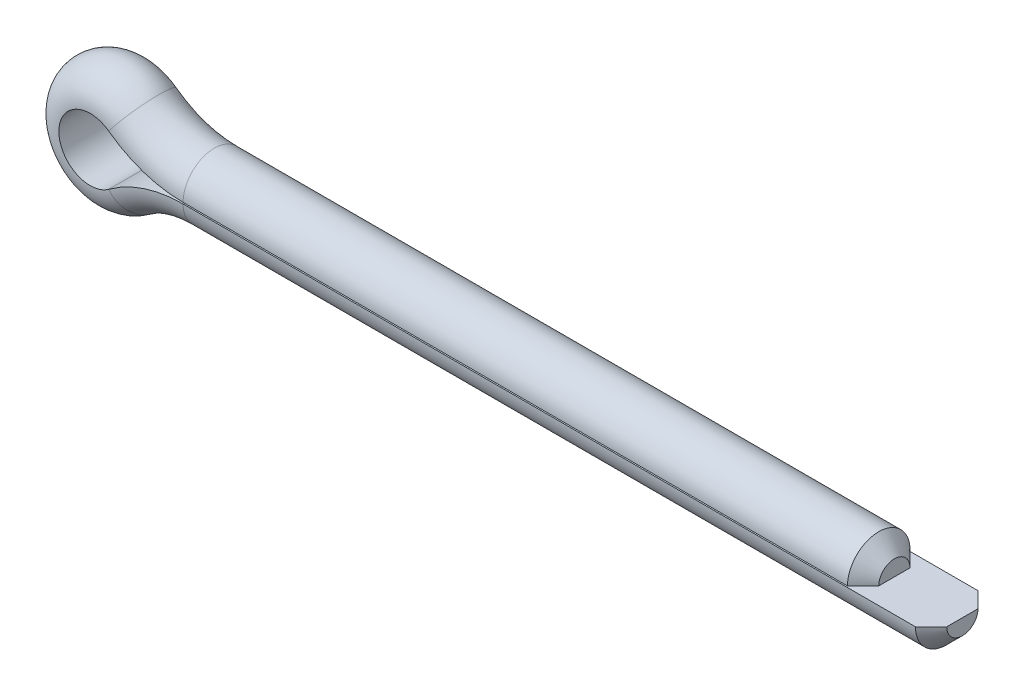
ISO-10303-21;
HEADER;
FILE_DESCRIPTION(('STEP AP214'),'2;1');
FILE_NAME('part.step','',(''),(''),'','','');
FILE_SCHEMA(('AUTOMOTIVE_DESIGN { 1 0 10303 214 1 1 1 1 }'));
ENDSEC;
DATA;
#1=APPLICATION_CONTEXT('core data for automotive mechanical design processes');
#2=APPLICATION_PROTOCOL_DEFINITION('international standard','automotive_design',2000,#1);
#3=PRODUCT_CONTEXT('',#1,'mechanical');
#4=PRODUCT('Part','Part','',(#3));
#5=PRODUCT_RELATED_PRODUCT_CATEGORY('part','',(#4));
#6=PRODUCT_DEFINITION_FORMATION('','',#4);
#7=PRODUCT_DEFINITION_CONTEXT('part definition',#1,'design');
#8=PRODUCT_DEFINITION('design','',#6,#7);
#9=PRODUCT_DEFINITION_SHAPE('','',#8);
#10=(LENGTH_UNIT() NAMED_UNIT(*) SI_UNIT(.MILLI.,.METRE.));
#11=(NAMED_UNIT(*) PLANE_ANGLE_UNIT() SI_UNIT($,.RADIAN.));
#12=(NAMED_UNIT(*) SI_UNIT($,.STERADIAN.) SOLID_ANGLE_UNIT());
#13=UNCERTAINTY_MEASURE_WITH_UNIT(LENGTH_MEASURE(1.E-05),#10,'distance_accuracy_value','');
#14=(GEOMETRIC_REPRESENTATION_CONTEXT(3) GLOBAL_UNCERTAINTY_ASSIGNED_CONTEXT((#13)) GLOBAL_UNIT_ASSIGNED_CONTEXT((#10,
#11,#12)) REPRESENTATION_CONTEXT('',''));
#15=CARTESIAN_POINT('',(0.,0.,0.));
#16=DIRECTION('',(0.,0.,1.));
#17=DIRECTION('',(1.,0.,0.));
#18=AXIS2_PLACEMENT_3D('',#15,#16,#17);
#19=CARTESIAN_POINT('',(-25.,-0.0254000000000053,1.15));
#20=DIRECTION('',(0.,-1.,0.));
#21=DIRECTION('',(1.,0.,0.));
#22=AXIS2_PLACEMENT_3D('',#19,#20,#21);
#23=PLANE('',#22);
#24=DIRECTION('',(1.,0.,0.));
#25=VECTOR('',#24,1.);
#26=CARTESIAN_POINT('',(-25.,-0.0254000000000053,1.15));
#27=LINE('',#26,#25);
#28=CARTESIAN_POINT('',(-25.,-0.0254000000000053,1.15));
#29=VERTEX_POINT('',#28);
#30=CARTESIAN_POINT('',(1.92500000000003,-0.0254000000000052,1.15));
#31=VERTEX_POINT('',#30);
#32=EDGE_CURVE('E155',#29,#31,#27,.T.);
#33=ORIENTED_EDGE('',*,*,#32,.T.);
#34=DIRECTION('',(-0.70710678118654,0.,0.707106781186555));
#35=VECTOR('',#34,1.);
#36=CARTESIAN_POINT('',(3.075,-0.0254000000000052,0.));
#37=LINE('',#36,#35);
#38=CARTESIAN_POINT('',(2.50000000000002,-0.0254000000000052,0.574999999999992));
#39=VERTEX_POINT('',#38);
#40=EDGE_CURVE('E166',#31,#39,#37,.F.);
#41=ORIENTED_EDGE('',*,*,#40,.T.);
#42=DIRECTION('',(0.,0.,-1.));
#43=VECTOR('',#42,1.);
#44=CARTESIAN_POINT('',(2.50000000000002,-0.0254000000000052,1.15));
#45=LINE('',#44,#43);
#46=CARTESIAN_POINT('',(2.50000000000002,-0.0254000000000052,-0.574999999999992));
#47=VERTEX_POINT('',#46);
#48=EDGE_CURVE('E152',#39,#47,#45,.T.);
#49=ORIENTED_EDGE('',*,*,#48,.T.);
#50=DIRECTION('',(0.70710678118654,0.,0.707106781186555));
#51=VECTOR('',#50,1.);
#52=CARTESIAN_POINT('',(3.075,-0.0254000000000052,0.));
#53=LINE('',#52,#51);
#54=CARTESIAN_POINT('',(1.92500000000003,-0.0254000000000052,-1.15));
#55=VERTEX_POINT('',#54);
#56=EDGE_CURVE('E164',#47,#55,#53,.F.);
#57=ORIENTED_EDGE('',*,*,#56,.T.);
#58=DIRECTION('',(1.,0.,0.));
#59=VECTOR('',#58,1.);
#60=CARTESIAN_POINT('',(-25.,-0.0254000000000053,-1.15));
#61=LINE('',#60,#59);
#62=CARTESIAN_POINT('',(-25.,-0.0254000000000053,-1.15));
#63=VERTEX_POINT('',#62);
#64=EDGE_CURVE('E158',#63,#55,#61,.T.);
#65=ORIENTED_EDGE('',*,*,#64,.F.);
#66=DIRECTION('',(0.,0.,-1.));
#67=VECTOR('',#66,1.);
#68=CARTESIAN_POINT('',(-25.,-0.0254000000000053,1.15));
#69=LINE('',#68,#67);
#70=EDGE_CURVE('E143',#29,#63,#69,.T.);
#71=ORIENTED_EDGE('',*,*,#70,.F.);
#72=EDGE_LOOP('',(#33,#41,#49,#57,#65,#71));
#73=FACE_BOUND('',#72,.T.);
#74=ADVANCED_FACE('F32',(#73),#23,.F.);
#75=CARTESIAN_POINT('',(-25.,-0.0254000000000053,0.));
#76=DIRECTION('',(1.,0.,0.));
#77=DIRECTION('',(0.,1.,0.));
#78=AXIS2_PLACEMENT_3D('',#75,#76,#77);
#79=CYLINDRICAL_SURFACE('',#78,1.15);
#80=ORIENTED_EDGE('',*,*,#64,.T.);
#81=CARTESIAN_POINT('',(1.92500000000003,-0.0254000000000052,0.));
#82=DIRECTION('',(-1.,0.,0.));
#83=DIRECTION('',(0.,0.,1.));
#84=AXIS2_PLACEMENT_3D('',#81,#82,#83);
#85=CIRCLE('',#84,1.15);
#86=EDGE_CURVE('E161',#55,#31,#85,.T.);
#87=ORIENTED_EDGE('',*,*,#86,.T.);
#88=ORIENTED_EDGE('',*,*,#32,.F.);
#89=CARTESIAN_POINT('',(-25.,-0.0254000000000053,0.));
#90=DIRECTION('',(-1.,0.,0.));
#91=DIRECTION('',(0.,0.,-1.));
#92=AXIS2_PLACEMENT_3D('',#89,#90,#91);
#93=CIRCLE('',#92,1.15);
#94=EDGE_CURVE('E140',#63,#29,#93,.T.);
#95=ORIENTED_EDGE('',*,*,#94,.F.);
#96=EDGE_LOOP('',(#80,#87,#88,#95));
#97=FACE_BOUND('',#96,.T.);
#98=ADVANCED_FACE('F186',(#97),#79,.T.);
#99=CARTESIAN_POINT('',(-25.,-4.6254,0.));
#100=DIRECTION('',(0.,0.,-1.));
#101=DIRECTION('',(-1.,0.,0.));
#102=AXIS2_PLACEMENT_3D('',#99,#100,#101);
#103=CYLINDRICAL_SURFACE('',#102,4.6);
#104=DIRECTION('',(0.,0.,-1.));
#105=VECTOR('',#104,1.);
#106=CARTESIAN_POINT('',(-27.7326968177242,-0.925079999999991,1.15));
#107=LINE('',#106,#105);
#108=CARTESIAN_POINT('',(-27.7326968177242,-0.925079999999991,1.15));
#109=VERTEX_POINT('',#108);
#110=CARTESIAN_POINT('',(-27.7326968177242,-0.925079999999991,-1.15));
#111=VERTEX_POINT('',#110);
#112=EDGE_CURVE('E131',#109,#111,#107,.T.);
#113=ORIENTED_EDGE('',*,*,#112,.F.);
#114=CARTESIAN_POINT('',(-25.,-4.6254,1.15));
#115=DIRECTION('',(0.,0.,-1.));
#116=DIRECTION('',(-1.,0.,0.));
#117=AXIS2_PLACEMENT_3D('',#114,#115,#116);
#118=CIRCLE('',#117,4.6);
#119=EDGE_CURVE('E146',#109,#29,#118,.T.);
#120=ORIENTED_EDGE('',*,*,#119,.T.);
#121=ORIENTED_EDGE('',*,*,#70,.T.);
#122=CARTESIAN_POINT('',(-25.,-4.6254,-1.15));
#123=DIRECTION('',(0.,0.,-1.));
#124=DIRECTION('',(-1.,0.,0.));
#125=AXIS2_PLACEMENT_3D('',#122,#123,#124);
#126=CIRCLE('',#125,4.6);
#127=EDGE_CURVE('E149',#111,#63,#126,.T.);
#128=ORIENTED_EDGE('',*,*,#127,.F.);
#129=EDGE_LOOP('',(#113,#120,#121,#128));
#130=FACE_BOUND('',#129,.T.);
#131=ADVANCED_FACE('F192',(#130),#103,.T.);
#132=CARTESIAN_POINT('',(-25.,-4.6254,0.));
#133=DIRECTION('',(0.,0.,-1.));
#134=DIRECTION('',(-1.,0.,0.));
#135=AXIS2_PLACEMENT_3D('',#132,#133,#134);
#136=TOROIDAL_SURFACE('',#135,4.6,1.15);
#137=CARTESIAN_POINT('',(-27.7326968177242,-0.925079999999991,0.));
#138=DIRECTION('',(-0.804417391304337,-0.594064525592233,0.));
#139=DIRECTION('',(0.,0.,-1.));
#140=AXIS2_PLACEMENT_3D('',#137,#138,#139);
#141=CIRCLE('',#140,1.15);
#142=EDGE_CURVE('E128',#111,#109,#141,.T.);
#143=ORIENTED_EDGE('',*,*,#142,.F.);
#144=ORIENTED_EDGE('',*,*,#127,.T.);
#145=ORIENTED_EDGE('',*,*,#94,.T.);
#146=ORIENTED_EDGE('',*,*,#119,.F.);
#147=EDGE_LOOP('',(#143,#144,#145,#146));
#148=FACE_BOUND('',#147,.T.);
#149=ADVANCED_FACE('F198',(#148),#136,.T.);
#150=CARTESIAN_POINT('',(-28.4158710221553,0.,0.));
#151=DIRECTION('',(0.,0.,1.));
#152=DIRECTION('',(1.,0.,0.));
#153=AXIS2_PLACEMENT_3D('',#150,#151,#152);
#154=CYLINDRICAL_SURFACE('',#153,1.15);
#155=DIRECTION('',(0.,0.,-1.));
#156=VECTOR('',#155,1.);
#157=CARTESIAN_POINT('',(-27.7326968177242,0.92508,1.15));
#158=LINE('',#157,#156);
#159=CARTESIAN_POINT('',(-27.7326968177242,0.92508,1.15));
#160=VERTEX_POINT('',#159);
#161=CARTESIAN_POINT('',(-27.7326968177242,0.92508,-1.15));
#162=VERTEX_POINT('',#161);
#163=EDGE_CURVE('E108',#160,#162,#158,.T.);
#164=ORIENTED_EDGE('',*,*,#163,.F.);
#165=CARTESIAN_POINT('',(-28.4158710221553,0.,1.15));
#166=DIRECTION('',(0.,0.,1.));
#167=DIRECTION('',(1.,0.,0.));
#168=AXIS2_PLACEMENT_3D('',#165,#166,#167);
#169=CIRCLE('',#168,1.15);
#170=EDGE_CURVE('E134',#160,#109,#169,.T.);
#171=ORIENTED_EDGE('',*,*,#170,.T.);
#172=ORIENTED_EDGE('',*,*,#112,.T.);
#173=CARTESIAN_POINT('',(-28.4158710221553,0.,-1.15));
#174=DIRECTION('',(0.,0.,1.));
#175=DIRECTION('',(1.,0.,0.));
#176=AXIS2_PLACEMENT_3D('',#173,#174,#175);
#177=CIRCLE('',#176,1.15);
#178=EDGE_CURVE('E137',#162,#111,#177,.T.);
#179=ORIENTED_EDGE('',*,*,#178,.F.);
#180=EDGE_LOOP('',(#164,#171,#172,#179));
#181=FACE_BOUND('',#180,.T.);
#182=ADVANCED_FACE('F202',(#181),#154,.F.);
#183=CARTESIAN_POINT('',(-28.4158710221553,0.,0.));
#184=DIRECTION('',(0.,0.,1.));
#185=DIRECTION('',(1.,0.,0.));
#186=AXIS2_PLACEMENT_3D('',#183,#184,#185);
#187=TOROIDAL_SURFACE('',#186,1.15,1.15);
#188=CARTESIAN_POINT('',(-27.7326968177242,0.92508,0.));
#189=DIRECTION('',(0.804417391304348,-0.594064525592218,0.));
#190=DIRECTION('',(0.,0.,-1.));
#191=AXIS2_PLACEMENT_3D('',#188,#189,#190);
#192=CIRCLE('',#191,1.15);
#193=EDGE_CURVE('E104',#162,#160,#192,.T.);
#194=ORIENTED_EDGE('',*,*,#193,.F.);
#195=ORIENTED_EDGE('',*,*,#178,.T.);
#196=ORIENTED_EDGE('',*,*,#142,.T.);
#197=ORIENTED_EDGE('',*,*,#170,.F.);
#198=EDGE_LOOP('',(#194,#195,#196,#197));
#199=FACE_BOUND('',#198,.T.);
#200=ADVANCED_FACE('F206',(#199),#187,.T.);
#201=CARTESIAN_POINT('',(-25.,4.6254,0.));
#202=DIRECTION('',(0.,0.,-1.));
#203=DIRECTION('',(-1.,0.,0.));
#204=AXIS2_PLACEMENT_3D('',#201,#202,#203);
#205=CYLINDRICAL_SURFACE('',#204,4.6);
#206=DIRECTION('',(0.,0.,-1.));
#207=VECTOR('',#206,1.);
#208=CARTESIAN_POINT('',(-25.,0.0254000000000009,1.15));
#209=LINE('',#208,#207);
#210=CARTESIAN_POINT('',(-25.,0.0254000000000009,1.15));
#211=VERTEX_POINT('',#210);
#212=CARTESIAN_POINT('',(-25.,0.0254000000000009,-1.15));
#213=VERTEX_POINT('',#212);
#214=EDGE_CURVE('E111',#211,#213,#209,.T.);
#215=ORIENTED_EDGE('',*,*,#214,.F.);
#216=CARTESIAN_POINT('',(-25.,4.6254,1.15));
#217=DIRECTION('',(0.,0.,-1.));
#218=DIRECTION('',(-1.,0.,0.));
#219=AXIS2_PLACEMENT_3D('',#216,#217,#218);
#220=CIRCLE('',#219,4.6);
#221=EDGE_CURVE('E97',#211,#160,#220,.T.);
#222=ORIENTED_EDGE('',*,*,#221,.T.);
#223=ORIENTED_EDGE('',*,*,#163,.T.);
#224=CARTESIAN_POINT('',(-25.,4.6254,-1.15));
#225=DIRECTION('',(0.,0.,-1.));
#226=DIRECTION('',(-1.,0.,0.));
#227=AXIS2_PLACEMENT_3D('',#224,#225,#226);
#228=CIRCLE('',#227,4.6);
#229=EDGE_CURVE('E107',#213,#162,#228,.T.);
#230=ORIENTED_EDGE('',*,*,#229,.F.);
#231=EDGE_LOOP('',(#215,#222,#223,#230));
#232=FACE_BOUND('',#231,.T.);
#233=ADVANCED_FACE('F112',(#232),#205,.T.);
#234=CARTESIAN_POINT('',(-25.,4.6254,0.));
#235=DIRECTION('',(0.,0.,-1.));
#236=DIRECTION('',(-1.,0.,0.));
#237=AXIS2_PLACEMENT_3D('',#234,#235,#236);
#238=TOROIDAL_SURFACE('',#237,4.6,1.15);
#239=CARTESIAN_POINT('',(-25.,0.0254000000000009,0.));
#240=DIRECTION('',(1.,0.,0.));
#241=DIRECTION('',(0.,0.,-1.));
#242=AXIS2_PLACEMENT_3D('',#239,#240,#241);
#243=CIRCLE('',#242,1.15);
#244=EDGE_CURVE('E102',#213,#211,#243,.T.);
#245=ORIENTED_EDGE('',*,*,#244,.F.);
#246=ORIENTED_EDGE('',*,*,#229,.T.);
#247=ORIENTED_EDGE('',*,*,#193,.T.);
#248=ORIENTED_EDGE('',*,*,#221,.F.);
#249=EDGE_LOOP('',(#245,#246,#247,#248));
#250=FACE_BOUND('',#249,.T.);
#251=ADVANCED_FACE('F99',(#250),#238,.T.);
#252=CARTESIAN_POINT('',(-25.,0.0254000000000009,0.));
#253=DIRECTION('',(1.,0.,0.));
#254=DIRECTION('',(0.,1.,0.));
#255=AXIS2_PLACEMENT_3D('',#252,#253,#254);
#256=CYLINDRICAL_SURFACE('',#255,1.15);
#257=DIRECTION('',(1.,0.,0.));
#258=VECTOR('',#257,1.);
#259=CARTESIAN_POINT('',(-25.,0.0254000000000009,1.15));
#260=LINE('',#259,#258);
#261=CARTESIAN_POINT('',(-0.575000000000006,0.0254,1.15));
#262=VERTEX_POINT('',#261);
#263=EDGE_CURVE('E113',#211,#262,#260,.T.);
#264=ORIENTED_EDGE('',*,*,#263,.T.);
#265=CARTESIAN_POINT('',(-0.575000000000006,0.0254,0.));
#266=DIRECTION('',(1.,0.,0.));
#267=DIRECTION('',(0.,1.,0.));
#268=AXIS2_PLACEMENT_3D('',#265,#266,#267);
#269=CIRCLE('',#268,1.15);
#270=CARTESIAN_POINT('',(-0.575000000000001,0.0254,-1.15));
#271=VERTEX_POINT('',#270);
#272=EDGE_CURVE('E11',#262,#271,#269,.F.);
#273=ORIENTED_EDGE('',*,*,#272,.T.);
#274=DIRECTION('',(1.,0.,0.));
#275=VECTOR('',#274,1.);
#276=CARTESIAN_POINT('',(-25.,0.0254000000000009,-1.15));
#277=LINE('',#276,#275);
#278=EDGE_CURVE('E116',#213,#271,#277,.T.);
#279=ORIENTED_EDGE('',*,*,#278,.F.);
#280=ORIENTED_EDGE('',*,*,#244,.T.);
#281=EDGE_LOOP('',(#264,#273,#279,#280));
#282=FACE_BOUND('',#281,.T.);
#283=ADVANCED_FACE('F118',(#282),#256,.T.);
#284=CARTESIAN_POINT('',(-25.,0.0254000000000009,1.15));
#285=DIRECTION('',(0.,-1.,0.));
#286=DIRECTION('',(1.,0.,0.));
#287=AXIS2_PLACEMENT_3D('',#284,#285,#286);
#288=PLANE('',#287);
#289=DIRECTION('',(0.,0.,-1.));
#290=VECTOR('',#289,1.);
#291=CARTESIAN_POINT('',(0.,0.0254,1.15));
#292=LINE('',#291,#290);
#293=CARTESIAN_POINT('',(0.,0.0254,0.574999999999999));
#294=VERTEX_POINT('',#293);
#295=CARTESIAN_POINT('',(0.,0.0254,-0.574999999999999));
#296=VERTEX_POINT('',#295);
#297=EDGE_CURVE('E119',#294,#296,#292,.T.);
#298=ORIENTED_EDGE('',*,*,#297,.F.);
#299=DIRECTION('',(-0.707106781186551,0.,0.707106781186544));
#300=VECTOR('',#299,1.);
#301=CARTESIAN_POINT('',(0.575000000000005,0.0254,0.));
#302=LINE('',#301,#300);
#303=EDGE_CURVE('E40',#294,#262,#302,.T.);
#304=ORIENTED_EDGE('',*,*,#303,.T.);
#305=ORIENTED_EDGE('',*,*,#263,.F.);
#306=ORIENTED_EDGE('',*,*,#214,.T.);
#307=ORIENTED_EDGE('',*,*,#278,.T.);
#308=DIRECTION('',(0.707106781186551,0.,0.707106781186544));
#309=VECTOR('',#308,1.);
#310=CARTESIAN_POINT('',(0.575000000000005,0.0254,0.));
#311=LINE('',#310,#309);
#312=EDGE_CURVE('E173',#271,#296,#311,.T.);
#313=ORIENTED_EDGE('',*,*,#312,.T.);
#314=EDGE_LOOP('',(#298,#304,#305,#306,#307,#313));
#315=FACE_BOUND('',#314,.T.);
#316=ADVANCED_FACE('F115',(#315),#288,.T.);
#317=CARTESIAN_POINT('',(2.50000000000002,-0.0254000000000052,0.));
#318=DIRECTION('',(-1.,0.,0.));
#319=DIRECTION('',(0.,0.,-1.));
#320=AXIS2_PLACEMENT_3D('',#317,#318,#319);
#321=PLANE('',#320);
#322=ORIENTED_EDGE('',*,*,#48,.F.);
#323=CARTESIAN_POINT('',(2.50000000000002,-0.0254000000000052,0.));
#324=DIRECTION('',(-1.,0.,0.));
#325=DIRECTION('',(0.,-1.,0.));
#326=AXIS2_PLACEMENT_3D('',#323,#324,#325);
#327=CIRCLE('',#326,0.574999999999992);
#328=EDGE_CURVE('E168',#39,#47,#327,.F.);
#329=ORIENTED_EDGE('',*,*,#328,.T.);
#330=EDGE_LOOP('',(#322,#329));
#331=FACE_BOUND('',#330,.T.);
#332=ADVANCED_FACE('F219',(#331),#321,.F.);
#333=CARTESIAN_POINT('',(0.,0.0254,0.));
#334=DIRECTION('',(1.,0.,0.));
#335=DIRECTION('',(0.,0.,-1.));
#336=AXIS2_PLACEMENT_3D('',#333,#334,#335);
#337=PLANE('',#336);
#338=ORIENTED_EDGE('',*,*,#297,.T.);
#339=CARTESIAN_POINT('',(0.,0.0254,0.));
#340=DIRECTION('',(1.,0.,0.));
#341=DIRECTION('',(0.,0.,-1.));
#342=AXIS2_PLACEMENT_3D('',#339,#340,#341);
#343=CIRCLE('',#342,0.574999999999999);
#344=EDGE_CURVE('E170',#296,#294,#343,.T.);
#345=ORIENTED_EDGE('',*,*,#344,.T.);
#346=EDGE_LOOP('',(#338,#345));
#347=FACE_BOUND('',#346,.T.);
#348=ADVANCED_FACE('F178',(#347),#337,.T.);
#349=CARTESIAN_POINT('',(1.92500000000003,-0.0254000000000052,0.));
#350=DIRECTION('',(-1.,0.,0.));
#351=DIRECTION('',(0.,0.,1.));
#352=AXIS2_PLACEMENT_3D('',#349,#350,#351);
#353=CONICAL_SURFACE('',#352,1.15,0.785398163397459);
#354=ORIENTED_EDGE('',*,*,#56,.F.);
#355=ORIENTED_EDGE('',*,*,#328,.F.);
#356=ORIENTED_EDGE('',*,*,#40,.F.);
#357=ORIENTED_EDGE('',*,*,#86,.F.);
#358=EDGE_LOOP('',(#354,#355,#356,#357));
#359=FACE_BOUND('',#358,.T.);
#360=ADVANCED_FACE('F180',(#359),#353,.T.);
#361=CARTESIAN_POINT('',(0.,0.0254,0.));
#362=DIRECTION('',(-1.,0.,0.));
#363=DIRECTION('',(0.,-1.,0.));
#364=AXIS2_PLACEMENT_3D('',#361,#362,#363);
#365=CONICAL_SURFACE('',#364,0.574999999999999,0.785398163397444);
#366=ORIENTED_EDGE('',*,*,#312,.F.);
#367=ORIENTED_EDGE('',*,*,#272,.F.);
#368=ORIENTED_EDGE('',*,*,#303,.F.);
#369=ORIENTED_EDGE('',*,*,#344,.F.);
#370=EDGE_LOOP('',(#366,#367,#368,#369));
#371=FACE_BOUND('',#370,.T.);
#372=ADVANCED_FACE('F34',(#371),#365,.T.);
#373=CLOSED_SHELL('',(#74,#98,#131,#149,#182,#200,#233,#251,#283,#316,#332,#348,#360,#372));
#374=MANIFOLD_SOLID_BREP('B2',#373);
#375=ADVANCED_BREP_SHAPE_REPRESENTATION('',(#18,#374),#14);
#376=SHAPE_DEFINITION_REPRESENTATION(#9,#375);
ENDSEC;
END-ISO-10303-21;
